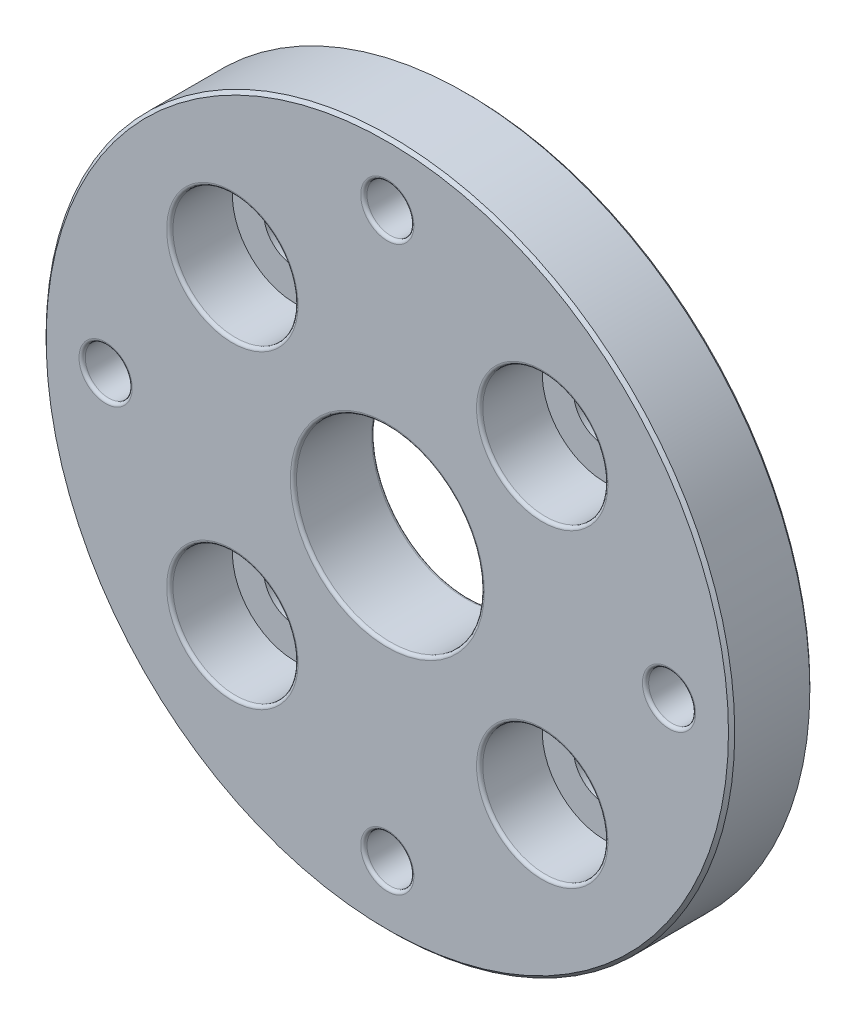
ISO-10303-21;
HEADER;
FILE_DESCRIPTION(('STEP AP214'),'2;1');
FILE_NAME('part.step','',(''),(''),'','','');
FILE_SCHEMA(('AUTOMOTIVE_DESIGN { 1 0 10303 214 1 1 1 1 }'));
ENDSEC;
DATA;
#1=APPLICATION_CONTEXT('core data for automotive mechanical design processes');
#2=APPLICATION_PROTOCOL_DEFINITION('international standard','automotive_design',2000,#1);
#3=PRODUCT_CONTEXT('',#1,'mechanical');
#4=PRODUCT('Part','Part','',(#3));
#5=PRODUCT_RELATED_PRODUCT_CATEGORY('part','',(#4));
#6=PRODUCT_DEFINITION_FORMATION('','',#4);
#7=PRODUCT_DEFINITION_CONTEXT('part definition',#1,'design');
#8=PRODUCT_DEFINITION('design','',#6,#7);
#9=PRODUCT_DEFINITION_SHAPE('','',#8);
#10=(LENGTH_UNIT() NAMED_UNIT(*) SI_UNIT(.MILLI.,.METRE.));
#11=(NAMED_UNIT(*) PLANE_ANGLE_UNIT() SI_UNIT($,.RADIAN.));
#12=(NAMED_UNIT(*) SI_UNIT($,.STERADIAN.) SOLID_ANGLE_UNIT());
#13=UNCERTAINTY_MEASURE_WITH_UNIT(LENGTH_MEASURE(1.E-05),#10,'distance_accuracy_value','');
#14=(GEOMETRIC_REPRESENTATION_CONTEXT(3) GLOBAL_UNCERTAINTY_ASSIGNED_CONTEXT((#13)) GLOBAL_UNIT_ASSIGNED_CONTEXT((#10,
#11,#12)) REPRESENTATION_CONTEXT('',''));
#15=CARTESIAN_POINT('',(0.,0.,0.));
#16=DIRECTION('',(0.,0.,1.));
#17=DIRECTION('',(1.,0.,0.));
#18=AXIS2_PLACEMENT_3D('',#15,#16,#17);
#19=CARTESIAN_POINT('',(4.94974746830582,4.94974746830584,0.));
#20=DIRECTION('',(0.,0.,1.));
#21=DIRECTION('',(1.,0.,0.));
#22=AXIS2_PLACEMENT_3D('',#19,#20,#21);
#23=CYLINDRICAL_SURFACE('',#22,1.);
#24=CARTESIAN_POINT('',(4.94974746830582,4.94974746830584,0.1));
#25=DIRECTION('',(0.,0.,1.));
#26=DIRECTION('',(1.,0.,0.));
#27=AXIS2_PLACEMENT_3D('',#24,#25,#26);
#28=CIRCLE('',#27,1.);
#29=CARTESIAN_POINT('',(5.94974746830582,4.94974746830584,0.1));
#30=VERTEX_POINT('',#29);
#31=EDGE_CURVE('E116',#30,#30,#28,.F.);
#32=ORIENTED_EDGE('',*,*,#31,.T.);
#33=EDGE_LOOP('',(#32));
#34=FACE_BOUND('',#33,.T.);
#35=CARTESIAN_POINT('',(4.94974746830582,4.94974746830584,0.6));
#36=DIRECTION('',(0.,0.,1.));
#37=DIRECTION('',(1.,0.,0.));
#38=AXIS2_PLACEMENT_3D('',#35,#36,#37);
#39=CIRCLE('',#38,1.);
#40=CARTESIAN_POINT('',(5.94974746830582,4.94974746830584,0.6));
#41=VERTEX_POINT('',#40);
#42=EDGE_CURVE('E158',#41,#41,#39,.F.);
#43=ORIENTED_EDGE('',*,*,#42,.F.);
#44=EDGE_LOOP('',(#43));
#45=FACE_BOUND('',#44,.T.);
#46=ADVANCED_FACE('F30',(#34,#45),#23,.F.);
#47=CARTESIAN_POINT('',(4.94974746830612,-4.94974746830582,0.));
#48=DIRECTION('',(0.,0.,1.));
#49=DIRECTION('',(1.,0.,0.));
#50=AXIS2_PLACEMENT_3D('',#47,#48,#49);
#51=CYLINDRICAL_SURFACE('',#50,0.99999999999993);
#52=CARTESIAN_POINT('',(4.94974746830612,-4.94974746830582,0.1));
#53=DIRECTION('',(0.,0.,1.));
#54=DIRECTION('',(1.,0.,0.));
#55=AXIS2_PLACEMENT_3D('',#52,#53,#54);
#56=CIRCLE('',#55,0.99999999999993);
#57=CARTESIAN_POINT('',(5.94974746830605,-4.94974746830582,0.1));
#58=VERTEX_POINT('',#57);
#59=EDGE_CURVE('E107',#58,#58,#56,.F.);
#60=ORIENTED_EDGE('',*,*,#59,.T.);
#61=EDGE_LOOP('',(#60));
#62=FACE_BOUND('',#61,.T.);
#63=CARTESIAN_POINT('',(4.94974746830612,-4.94974746830582,0.6));
#64=DIRECTION('',(0.,0.,1.));
#65=DIRECTION('',(1.,0.,0.));
#66=AXIS2_PLACEMENT_3D('',#63,#64,#65);
#67=CIRCLE('',#66,0.99999999999993);
#68=CARTESIAN_POINT('',(5.94974746830605,-4.94974746830582,0.6));
#69=VERTEX_POINT('',#68);
#70=EDGE_CURVE('E161',#69,#69,#67,.F.);
#71=ORIENTED_EDGE('',*,*,#70,.F.);
#72=EDGE_LOOP('',(#71));
#73=FACE_BOUND('',#72,.T.);
#74=ADVANCED_FACE('F202',(#62,#73),#51,.F.);
#75=CARTESIAN_POINT('',(-4.94974746830555,-4.94974746830612,0.));
#76=DIRECTION('',(0.,0.,1.));
#77=DIRECTION('',(1.,0.,0.));
#78=AXIS2_PLACEMENT_3D('',#75,#76,#77);
#79=CYLINDRICAL_SURFACE('',#78,1.00000000000021);
#80=CARTESIAN_POINT('',(-4.94974746830555,-4.94974746830612,0.1));
#81=DIRECTION('',(0.,0.,1.));
#82=DIRECTION('',(1.,0.,0.));
#83=AXIS2_PLACEMENT_3D('',#80,#81,#82);
#84=CIRCLE('',#83,1.00000000000021);
#85=CARTESIAN_POINT('',(-3.94974746830534,-4.94974746830612,0.1));
#86=VERTEX_POINT('',#85);
#87=EDGE_CURVE('E98',#86,#86,#84,.F.);
#88=ORIENTED_EDGE('',*,*,#87,.T.);
#89=EDGE_LOOP('',(#88));
#90=FACE_BOUND('',#89,.T.);
#91=CARTESIAN_POINT('',(-4.94974746830555,-4.94974746830612,0.6));
#92=DIRECTION('',(0.,0.,1.));
#93=DIRECTION('',(1.,0.,0.));
#94=AXIS2_PLACEMENT_3D('',#91,#92,#93);
#95=CIRCLE('',#94,1.00000000000021);
#96=CARTESIAN_POINT('',(-3.94974746830534,-4.94974746830612,0.6));
#97=VERTEX_POINT('',#96);
#98=EDGE_CURVE('E164',#97,#97,#95,.F.);
#99=ORIENTED_EDGE('',*,*,#98,.F.);
#100=EDGE_LOOP('',(#99));
#101=FACE_BOUND('',#100,.T.);
#102=ADVANCED_FACE('F208',(#90,#101),#79,.F.);
#103=CARTESIAN_POINT('',(-4.94974746830584,4.94974746830555,0.));
#104=DIRECTION('',(0.,0.,1.));
#105=DIRECTION('',(1.,0.,0.));
#106=AXIS2_PLACEMENT_3D('',#103,#104,#105);
#107=CYLINDRICAL_SURFACE('',#106,1.0000000000003);
#108=CARTESIAN_POINT('',(-4.94974746830584,4.94974746830555,0.1));
#109=DIRECTION('',(0.,0.,1.));
#110=DIRECTION('',(1.,0.,0.));
#111=AXIS2_PLACEMENT_3D('',#108,#109,#110);
#112=CIRCLE('',#111,1.0000000000003);
#113=CARTESIAN_POINT('',(-3.94974746830554,4.94974746830555,0.1));
#114=VERTEX_POINT('',#113);
#115=EDGE_CURVE('E89',#114,#114,#112,.F.);
#116=ORIENTED_EDGE('',*,*,#115,.T.);
#117=EDGE_LOOP('',(#116));
#118=FACE_BOUND('',#117,.T.);
#119=CARTESIAN_POINT('',(-4.94974746830584,4.94974746830555,0.6));
#120=DIRECTION('',(0.,0.,1.));
#121=DIRECTION('',(1.,0.,0.));
#122=AXIS2_PLACEMENT_3D('',#119,#120,#121);
#123=CIRCLE('',#122,1.0000000000003);
#124=CARTESIAN_POINT('',(-3.94974746830554,4.94974746830555,0.6));
#125=VERTEX_POINT('',#124);
#126=EDGE_CURVE('E167',#125,#125,#123,.F.);
#127=ORIENTED_EDGE('',*,*,#126,.F.);
#128=EDGE_LOOP('',(#127));
#129=FACE_BOUND('',#128,.T.);
#130=ADVANCED_FACE('F214',(#118,#129),#107,.F.);
#131=CARTESIAN_POINT('',(0.,0.,2.6));
#132=DIRECTION('',(0.,0.,-1.));
#133=DIRECTION('',(-1.,0.,0.));
#134=AXIS2_PLACEMENT_3D('',#131,#132,#133);
#135=CYLINDRICAL_SURFACE('',#134,11.);
#136=CARTESIAN_POINT('',(0.,0.,0.0999999999999994));
#137=DIRECTION('',(0.,0.,1.));
#138=DIRECTION('',(1.,0.,0.));
#139=AXIS2_PLACEMENT_3D('',#136,#137,#138);
#140=CIRCLE('',#139,11.);
#141=CARTESIAN_POINT('',(11.,0.,0.0999999999999994));
#142=VERTEX_POINT('',#141);
#143=EDGE_CURVE('E152',#142,#142,#140,.T.);
#144=ORIENTED_EDGE('',*,*,#143,.T.);
#145=EDGE_LOOP('',(#144));
#146=FACE_BOUND('',#145,.T.);
#147=CARTESIAN_POINT('',(0.,0.,2.5));
#148=DIRECTION('',(0.,0.,1.));
#149=DIRECTION('',(1.,0.,0.));
#150=AXIS2_PLACEMENT_3D('',#147,#148,#149);
#151=CIRCLE('',#150,11.);
#152=CARTESIAN_POINT('',(11.,0.,2.5));
#153=VERTEX_POINT('',#152);
#154=EDGE_CURVE('E155',#153,#153,#151,.F.);
#155=ORIENTED_EDGE('',*,*,#154,.T.);
#156=EDGE_LOOP('',(#155));
#157=FACE_BOUND('',#156,.T.);
#158=ADVANCED_FACE('F233',(#146,#157),#135,.T.);
#159=CARTESIAN_POINT('',(0.,0.,2.6));
#160=DIRECTION('',(0.,0.,1.));
#161=DIRECTION('',(1.,0.,0.));
#162=AXIS2_PLACEMENT_3D('',#159,#160,#161);
#163=PLANE('',#162);
#164=CARTESIAN_POINT('',(9.00000000000025,2.54693202754403E-13,2.6));
#165=DIRECTION('',(0.,0.,1.));
#166=DIRECTION('',(1.,0.,0.));
#167=AXIS2_PLACEMENT_3D('',#164,#165,#166);
#168=CIRCLE('',#167,0.85);
#169=CARTESIAN_POINT('',(9.85000000000025,2.54693202754403E-13,2.6));
#170=VERTEX_POINT('',#169);
#171=EDGE_CURVE('E56',#170,#170,#168,.F.);
#172=ORIENTED_EDGE('',*,*,#171,.T.);
#173=EDGE_LOOP('',(#172));
#174=FACE_BOUND('',#173,.T.);
#175=CARTESIAN_POINT('',(5.09386405508807E-13,-9.,2.6));
#176=DIRECTION('',(0.,0.,1.));
#177=DIRECTION('',(1.,0.,0.));
#178=AXIS2_PLACEMENT_3D('',#175,#176,#177);
#179=CIRCLE('',#178,0.85);
#180=CARTESIAN_POINT('',(0.85000000000051,-9.,2.6));
#181=VERTEX_POINT('',#180);
#182=EDGE_CURVE('E59',#181,#181,#179,.F.);
#183=ORIENTED_EDGE('',*,*,#182,.T.);
#184=EDGE_LOOP('',(#183));
#185=FACE_BOUND('',#184,.T.);
#186=CARTESIAN_POINT('',(-8.99999999999974,-2.55795384873636E-13,2.6));
#187=DIRECTION('',(0.,0.,1.));
#188=DIRECTION('',(1.,0.,0.));
#189=AXIS2_PLACEMENT_3D('',#186,#187,#188);
#190=CIRCLE('',#189,0.85);
#191=CARTESIAN_POINT('',(-8.14999999999974,-2.55795384873636E-13,2.6));
#192=VERTEX_POINT('',#191);
#193=EDGE_CURVE('E62',#192,#192,#190,.F.);
#194=ORIENTED_EDGE('',*,*,#193,.T.);
#195=EDGE_LOOP('',(#194));
#196=FACE_BOUND('',#195,.T.);
#197=CARTESIAN_POINT('',(0.,9.,2.6));
#198=DIRECTION('',(0.,0.,1.));
#199=DIRECTION('',(1.,0.,0.));
#200=AXIS2_PLACEMENT_3D('',#197,#198,#199);
#201=CIRCLE('',#200,0.85);
#202=CARTESIAN_POINT('',(0.85,9.,2.6));
#203=VERTEX_POINT('',#202);
#204=EDGE_CURVE('E65',#203,#203,#201,.F.);
#205=ORIENTED_EDGE('',*,*,#204,.T.);
#206=EDGE_LOOP('',(#205));
#207=FACE_BOUND('',#206,.T.);
#208=CARTESIAN_POINT('',(4.94974746830612,-4.94974746830582,2.6));
#209=DIRECTION('',(0.,0.,1.));
#210=DIRECTION('',(1.,0.,0.));
#211=AXIS2_PLACEMENT_3D('',#208,#209,#210);
#212=CIRCLE('',#211,2.09999999999993);
#213=CARTESIAN_POINT('',(7.04974746830605,-4.94974746830582,2.6));
#214=VERTEX_POINT('',#213);
#215=EDGE_CURVE('E68',#214,#214,#212,.F.);
#216=ORIENTED_EDGE('',*,*,#215,.T.);
#217=EDGE_LOOP('',(#216));
#218=FACE_BOUND('',#217,.T.);
#219=CARTESIAN_POINT('',(-4.94974746830555,-4.94974746830612,2.6));
#220=DIRECTION('',(0.,0.,1.));
#221=DIRECTION('',(1.,0.,0.));
#222=AXIS2_PLACEMENT_3D('',#219,#220,#221);
#223=CIRCLE('',#222,2.10000000000021);
#224=CARTESIAN_POINT('',(-2.84974746830534,-4.94974746830612,2.6));
#225=VERTEX_POINT('',#224);
#226=EDGE_CURVE('E71',#225,#225,#223,.F.);
#227=ORIENTED_EDGE('',*,*,#226,.T.);
#228=EDGE_LOOP('',(#227));
#229=FACE_BOUND('',#228,.T.);
#230=CARTESIAN_POINT('',(-4.94974746830584,4.94974746830555,2.6));
#231=DIRECTION('',(0.,0.,1.));
#232=DIRECTION('',(1.,0.,0.));
#233=AXIS2_PLACEMENT_3D('',#230,#231,#232);
#234=CIRCLE('',#233,2.1000000000003);
#235=CARTESIAN_POINT('',(-2.84974746830554,4.94974746830555,2.6));
#236=VERTEX_POINT('',#235);
#237=EDGE_CURVE('E74',#236,#236,#234,.F.);
#238=ORIENTED_EDGE('',*,*,#237,.T.);
#239=EDGE_LOOP('',(#238));
#240=FACE_BOUND('',#239,.T.);
#241=CARTESIAN_POINT('',(0.,0.,2.6));
#242=DIRECTION('',(0.,0.,1.));
#243=DIRECTION('',(1.,0.,0.));
#244=AXIS2_PLACEMENT_3D('',#241,#242,#243);
#245=CIRCLE('',#244,3.1);
#246=CARTESIAN_POINT('',(3.1,0.,2.6));
#247=VERTEX_POINT('',#246);
#248=EDGE_CURVE('E77',#247,#247,#245,.F.);
#249=ORIENTED_EDGE('',*,*,#248,.T.);
#250=EDGE_LOOP('',(#249));
#251=FACE_BOUND('',#250,.T.);
#252=CARTESIAN_POINT('',(4.94974746830582,4.94974746830584,2.6));
#253=DIRECTION('',(0.,0.,1.));
#254=DIRECTION('',(1.,0.,0.));
#255=AXIS2_PLACEMENT_3D('',#252,#253,#254);
#256=CIRCLE('',#255,2.1);
#257=CARTESIAN_POINT('',(7.04974746830583,4.94974746830584,2.6));
#258=VERTEX_POINT('',#257);
#259=EDGE_CURVE('E80',#258,#258,#256,.F.);
#260=ORIENTED_EDGE('',*,*,#259,.T.);
#261=EDGE_LOOP('',(#260));
#262=FACE_BOUND('',#261,.T.);
#263=CARTESIAN_POINT('',(0.,0.,2.6));
#264=DIRECTION('',(0.,0.,1.));
#265=DIRECTION('',(1.,0.,0.));
#266=AXIS2_PLACEMENT_3D('',#263,#264,#265);
#267=CIRCLE('',#266,10.9);
#268=CARTESIAN_POINT('',(10.9,0.,2.6));
#269=VERTEX_POINT('',#268);
#270=EDGE_CURVE('E146',#269,#269,#267,.T.);
#271=ORIENTED_EDGE('',*,*,#270,.T.);
#272=EDGE_LOOP('',(#271));
#273=FACE_BOUND('',#272,.T.);
#274=ADVANCED_FACE('F230',(#174,#185,#196,#207,#218,#229,#240,#251,#262,#273),#163,.T.);
#275=CARTESIAN_POINT('',(0.,0.,0.));
#276=DIRECTION('',(0.,0.,1.));
#277=DIRECTION('',(1.,0.,0.));
#278=AXIS2_PLACEMENT_3D('',#275,#276,#277);
#279=PLANE('',#278);
#280=CARTESIAN_POINT('',(4.94974746830582,4.94974746830584,0.));
#281=DIRECTION('',(0.,0.,1.));
#282=DIRECTION('',(1.,0.,0.));
#283=AXIS2_PLACEMENT_3D('',#280,#281,#282);
#284=CIRCLE('',#283,1.1);
#285=CARTESIAN_POINT('',(6.04974746830582,4.94974746830584,0.));
#286=VERTEX_POINT('',#285);
#287=EDGE_CURVE('E119',#286,#286,#284,.T.);
#288=ORIENTED_EDGE('',*,*,#287,.T.);
#289=EDGE_LOOP('',(#288));
#290=FACE_BOUND('',#289,.T.);
#291=CARTESIAN_POINT('',(9.00000000000025,2.54693202754403E-13,0.));
#292=DIRECTION('',(0.,0.,1.));
#293=DIRECTION('',(1.,0.,0.));
#294=AXIS2_PLACEMENT_3D('',#291,#292,#293);
#295=CIRCLE('',#294,0.85);
#296=CARTESIAN_POINT('',(9.85000000000025,2.54693202754403E-13,0.));
#297=VERTEX_POINT('',#296);
#298=EDGE_CURVE('E122',#297,#297,#295,.T.);
#299=ORIENTED_EDGE('',*,*,#298,.T.);
#300=EDGE_LOOP('',(#299));
#301=FACE_BOUND('',#300,.T.);
#302=CARTESIAN_POINT('',(4.94974746830612,-4.94974746830582,0.));
#303=DIRECTION('',(0.,0.,1.));
#304=DIRECTION('',(1.,0.,0.));
#305=AXIS2_PLACEMENT_3D('',#302,#303,#304);
#306=CIRCLE('',#305,1.09999999999993);
#307=CARTESIAN_POINT('',(6.04974746830605,-4.94974746830582,0.));
#308=VERTEX_POINT('',#307);
#309=EDGE_CURVE('E125',#308,#308,#306,.T.);
#310=ORIENTED_EDGE('',*,*,#309,.T.);
#311=EDGE_LOOP('',(#310));
#312=FACE_BOUND('',#311,.T.);
#313=CARTESIAN_POINT('',(5.09386405508807E-13,-9.,0.));
#314=DIRECTION('',(0.,0.,1.));
#315=DIRECTION('',(1.,0.,0.));
#316=AXIS2_PLACEMENT_3D('',#313,#314,#315);
#317=CIRCLE('',#316,0.85);
#318=CARTESIAN_POINT('',(0.85000000000051,-9.,0.));
#319=VERTEX_POINT('',#318);
#320=EDGE_CURVE('E128',#319,#319,#317,.T.);
#321=ORIENTED_EDGE('',*,*,#320,.T.);
#322=EDGE_LOOP('',(#321));
#323=FACE_BOUND('',#322,.T.);
#324=CARTESIAN_POINT('',(-4.94974746830555,-4.94974746830612,0.));
#325=DIRECTION('',(0.,0.,1.));
#326=DIRECTION('',(1.,0.,0.));
#327=AXIS2_PLACEMENT_3D('',#324,#325,#326);
#328=CIRCLE('',#327,1.10000000000021);
#329=CARTESIAN_POINT('',(-3.84974746830534,-4.94974746830612,0.));
#330=VERTEX_POINT('',#329);
#331=EDGE_CURVE('E131',#330,#330,#328,.T.);
#332=ORIENTED_EDGE('',*,*,#331,.T.);
#333=EDGE_LOOP('',(#332));
#334=FACE_BOUND('',#333,.T.);
#335=CARTESIAN_POINT('',(0.,9.,0.));
#336=DIRECTION('',(0.,0.,1.));
#337=DIRECTION('',(1.,0.,0.));
#338=AXIS2_PLACEMENT_3D('',#335,#336,#337);
#339=CIRCLE('',#338,0.85);
#340=CARTESIAN_POINT('',(0.85,9.,0.));
#341=VERTEX_POINT('',#340);
#342=EDGE_CURVE('E134',#341,#341,#339,.T.);
#343=ORIENTED_EDGE('',*,*,#342,.T.);
#344=EDGE_LOOP('',(#343));
#345=FACE_BOUND('',#344,.T.);
#346=CARTESIAN_POINT('',(-4.94974746830584,4.94974746830555,0.));
#347=DIRECTION('',(0.,0.,1.));
#348=DIRECTION('',(1.,0.,0.));
#349=AXIS2_PLACEMENT_3D('',#346,#347,#348);
#350=CIRCLE('',#349,1.1000000000003);
#351=CARTESIAN_POINT('',(-3.84974746830554,4.94974746830555,0.));
#352=VERTEX_POINT('',#351);
#353=EDGE_CURVE('E137',#352,#352,#350,.T.);
#354=ORIENTED_EDGE('',*,*,#353,.T.);
#355=EDGE_LOOP('',(#354));
#356=FACE_BOUND('',#355,.T.);
#357=CARTESIAN_POINT('',(-8.99999999999974,-2.55795384873636E-13,0.));
#358=DIRECTION('',(0.,0.,1.));
#359=DIRECTION('',(1.,0.,0.));
#360=AXIS2_PLACEMENT_3D('',#357,#358,#359);
#361=CIRCLE('',#360,0.85);
#362=CARTESIAN_POINT('',(-8.14999999999974,-2.55795384873636E-13,0.));
#363=VERTEX_POINT('',#362);
#364=EDGE_CURVE('E140',#363,#363,#361,.T.);
#365=ORIENTED_EDGE('',*,*,#364,.T.);
#366=EDGE_LOOP('',(#365));
#367=FACE_BOUND('',#366,.T.);
#368=CARTESIAN_POINT('',(0.,0.,0.));
#369=DIRECTION('',(0.,0.,1.));
#370=DIRECTION('',(1.,0.,0.));
#371=AXIS2_PLACEMENT_3D('',#368,#369,#370);
#372=CIRCLE('',#371,3.1);
#373=CARTESIAN_POINT('',(3.1,0.,0.));
#374=VERTEX_POINT('',#373);
#375=EDGE_CURVE('E143',#374,#374,#372,.T.);
#376=ORIENTED_EDGE('',*,*,#375,.T.);
#377=EDGE_LOOP('',(#376));
#378=FACE_BOUND('',#377,.T.);
#379=CARTESIAN_POINT('',(0.,0.,0.));
#380=DIRECTION('',(0.,0.,1.));
#381=DIRECTION('',(1.,0.,0.));
#382=AXIS2_PLACEMENT_3D('',#379,#380,#381);
#383=CIRCLE('',#382,10.9);
#384=CARTESIAN_POINT('',(10.9,0.,0.));
#385=VERTEX_POINT('',#384);
#386=EDGE_CURVE('E149',#385,#385,#383,.F.);
#387=ORIENTED_EDGE('',*,*,#386,.T.);
#388=EDGE_LOOP('',(#387));
#389=FACE_BOUND('',#388,.T.);
#390=ADVANCED_FACE('F220',(#290,#301,#312,#323,#334,#345,#356,#367,#378,#389),#279,.F.);
#391=CARTESIAN_POINT('',(9.00000000000025,2.54693202754403E-13,0.));
#392=DIRECTION('',(0.,0.,1.));
#393=DIRECTION('',(1.,0.,0.));
#394=AXIS2_PLACEMENT_3D('',#391,#392,#393);
#395=CYLINDRICAL_SURFACE('',#394,0.75);
#396=CARTESIAN_POINT('',(9.00000000000025,2.54693202754403E-13,0.1));
#397=DIRECTION('',(0.,0.,1.));
#398=DIRECTION('',(1.,0.,0.));
#399=AXIS2_PLACEMENT_3D('',#396,#397,#398);
#400=CIRCLE('',#399,0.75);
#401=CARTESIAN_POINT('',(9.75000000000025,2.54693202754403E-13,0.1));
#402=VERTEX_POINT('',#401);
#403=EDGE_CURVE('E110',#402,#402,#400,.F.);
#404=ORIENTED_EDGE('',*,*,#403,.T.);
#405=EDGE_LOOP('',(#404));
#406=FACE_BOUND('',#405,.T.);
#407=CARTESIAN_POINT('',(9.00000000000025,2.54693202754403E-13,2.5));
#408=DIRECTION('',(0.,0.,1.));
#409=DIRECTION('',(1.,0.,0.));
#410=AXIS2_PLACEMENT_3D('',#407,#408,#409);
#411=CIRCLE('',#410,0.75);
#412=CARTESIAN_POINT('',(9.75000000000025,2.54693202754403E-13,2.5));
#413=VERTEX_POINT('',#412);
#414=EDGE_CURVE('E113',#413,#413,#411,.T.);
#415=ORIENTED_EDGE('',*,*,#414,.T.);
#416=EDGE_LOOP('',(#415));
#417=FACE_BOUND('',#416,.T.);
#418=ADVANCED_FACE('F216',(#406,#417),#395,.F.);
#419=CARTESIAN_POINT('',(5.09386405508807E-13,-9.,0.));
#420=DIRECTION('',(0.,0.,1.));
#421=DIRECTION('',(1.,0.,0.));
#422=AXIS2_PLACEMENT_3D('',#419,#420,#421);
#423=CYLINDRICAL_SURFACE('',#422,0.75);
#424=CARTESIAN_POINT('',(5.09386405508807E-13,-9.,0.1));
#425=DIRECTION('',(0.,0.,1.));
#426=DIRECTION('',(1.,0.,0.));
#427=AXIS2_PLACEMENT_3D('',#424,#425,#426);
#428=CIRCLE('',#427,0.75);
#429=CARTESIAN_POINT('',(0.75000000000051,-9.,0.1));
#430=VERTEX_POINT('',#429);
#431=EDGE_CURVE('E101',#430,#430,#428,.F.);
#432=ORIENTED_EDGE('',*,*,#431,.T.);
#433=EDGE_LOOP('',(#432));
#434=FACE_BOUND('',#433,.T.);
#435=CARTESIAN_POINT('',(5.09386405508807E-13,-9.,2.5));
#436=DIRECTION('',(0.,0.,1.));
#437=DIRECTION('',(1.,0.,0.));
#438=AXIS2_PLACEMENT_3D('',#435,#436,#437);
#439=CIRCLE('',#438,0.75);
#440=CARTESIAN_POINT('',(0.75000000000051,-9.,2.5));
#441=VERTEX_POINT('',#440);
#442=EDGE_CURVE('E104',#441,#441,#439,.T.);
#443=ORIENTED_EDGE('',*,*,#442,.T.);
#444=EDGE_LOOP('',(#443));
#445=FACE_BOUND('',#444,.T.);
#446=ADVANCED_FACE('F219',(#434,#445),#423,.F.);
#447=CARTESIAN_POINT('',(-8.99999999999974,-2.55795384873636E-13,0.));
#448=DIRECTION('',(0.,0.,1.));
#449=DIRECTION('',(1.,0.,0.));
#450=AXIS2_PLACEMENT_3D('',#447,#448,#449);
#451=CYLINDRICAL_SURFACE('',#450,0.75);
#452=CARTESIAN_POINT('',(-8.99999999999974,-2.55795384873636E-13,0.1));
#453=DIRECTION('',(0.,0.,1.));
#454=DIRECTION('',(1.,0.,0.));
#455=AXIS2_PLACEMENT_3D('',#452,#453,#454);
#456=CIRCLE('',#455,0.75);
#457=CARTESIAN_POINT('',(-8.24999999999974,-2.55795384873636E-13,0.1));
#458=VERTEX_POINT('',#457);
#459=EDGE_CURVE('E83',#458,#458,#456,.F.);
#460=ORIENTED_EDGE('',*,*,#459,.T.);
#461=EDGE_LOOP('',(#460));
#462=FACE_BOUND('',#461,.T.);
#463=CARTESIAN_POINT('',(-8.99999999999974,-2.55795384873636E-13,2.5));
#464=DIRECTION('',(0.,0.,1.));
#465=DIRECTION('',(1.,0.,0.));
#466=AXIS2_PLACEMENT_3D('',#463,#464,#465);
#467=CIRCLE('',#466,0.75);
#468=CARTESIAN_POINT('',(-8.24999999999974,-2.55795384873636E-13,2.5));
#469=VERTEX_POINT('',#468);
#470=EDGE_CURVE('E86',#469,#469,#467,.T.);
#471=ORIENTED_EDGE('',*,*,#470,.T.);
#472=EDGE_LOOP('',(#471));
#473=FACE_BOUND('',#472,.T.);
#474=ADVANCED_FACE('F224',(#462,#473),#451,.F.);
#475=CARTESIAN_POINT('',(0.,9.,0.));
#476=DIRECTION('',(0.,0.,1.));
#477=DIRECTION('',(1.,0.,0.));
#478=AXIS2_PLACEMENT_3D('',#475,#476,#477);
#479=CYLINDRICAL_SURFACE('',#478,0.75);
#480=CARTESIAN_POINT('',(0.,9.,0.1));
#481=DIRECTION('',(0.,0.,1.));
#482=DIRECTION('',(1.,0.,0.));
#483=AXIS2_PLACEMENT_3D('',#480,#481,#482);
#484=CIRCLE('',#483,0.75);
#485=CARTESIAN_POINT('',(0.75,9.,0.1));
#486=VERTEX_POINT('',#485);
#487=EDGE_CURVE('E92',#486,#486,#484,.F.);
#488=ORIENTED_EDGE('',*,*,#487,.T.);
#489=EDGE_LOOP('',(#488));
#490=FACE_BOUND('',#489,.T.);
#491=CARTESIAN_POINT('',(0.,9.,2.5));
#492=DIRECTION('',(0.,0.,1.));
#493=DIRECTION('',(1.,0.,0.));
#494=AXIS2_PLACEMENT_3D('',#491,#492,#493);
#495=CIRCLE('',#494,0.75);
#496=CARTESIAN_POINT('',(0.75,9.,2.5));
#497=VERTEX_POINT('',#496);
#498=EDGE_CURVE('E95',#497,#497,#495,.T.);
#499=ORIENTED_EDGE('',*,*,#498,.T.);
#500=EDGE_LOOP('',(#499));
#501=FACE_BOUND('',#500,.T.);
#502=ADVANCED_FACE('F228',(#490,#501),#479,.F.);
#503=CARTESIAN_POINT('',(-4.94974746830584,4.94974746830555,0.6));
#504=DIRECTION('',(0.,0.,1.));
#505=DIRECTION('',(1.,0.,0.));
#506=AXIS2_PLACEMENT_3D('',#503,#504,#505);
#507=PLANE('',#506);
#508=CARTESIAN_POINT('',(-4.94974746830584,4.94974746830555,0.6));
#509=DIRECTION('',(0.,0.,1.));
#510=DIRECTION('',(1.,0.,0.));
#511=AXIS2_PLACEMENT_3D('',#508,#509,#510);
#512=CIRCLE('',#511,2.0000000000003);
#513=CARTESIAN_POINT('',(-2.94974746830554,4.94974746830555,0.6));
#514=VERTEX_POINT('',#513);
#515=EDGE_CURVE('E174',#514,#514,#512,.T.);
#516=ORIENTED_EDGE('',*,*,#515,.T.);
#517=EDGE_LOOP('',(#516));
#518=FACE_BOUND('',#517,.T.);
#519=ORIENTED_EDGE('',*,*,#126,.T.);
#520=EDGE_LOOP('',(#519));
#521=FACE_BOUND('',#520,.T.);
#522=ADVANCED_FACE('F346',(#518,#521),#507,.T.);
#523=CARTESIAN_POINT('',(-4.94974746830584,4.94974746830555,0.6));
#524=DIRECTION('',(0.,0.,1.));
#525=DIRECTION('',(1.,0.,0.));
#526=AXIS2_PLACEMENT_3D('',#523,#524,#525);
#527=CYLINDRICAL_SURFACE('',#526,2.0000000000003);
#528=CARTESIAN_POINT('',(-4.94974746830584,4.94974746830555,2.5));
#529=DIRECTION('',(0.,0.,1.));
#530=DIRECTION('',(1.,0.,0.));
#531=AXIS2_PLACEMENT_3D('',#528,#529,#530);
#532=CIRCLE('',#531,2.0000000000003);
#533=CARTESIAN_POINT('',(-2.94974746830554,4.94974746830555,2.5));
#534=VERTEX_POINT('',#533);
#535=EDGE_CURVE('E45',#534,#534,#532,.T.);
#536=ORIENTED_EDGE('',*,*,#535,.T.);
#537=EDGE_LOOP('',(#536));
#538=FACE_BOUND('',#537,.T.);
#539=ORIENTED_EDGE('',*,*,#515,.F.);
#540=EDGE_LOOP('',(#539));
#541=FACE_BOUND('',#540,.T.);
#542=ADVANCED_FACE('F360',(#538,#541),#527,.F.);
#543=CARTESIAN_POINT('',(-4.94974746830555,-4.94974746830612,0.6));
#544=DIRECTION('',(0.,0.,1.));
#545=DIRECTION('',(1.,0.,0.));
#546=AXIS2_PLACEMENT_3D('',#543,#544,#545);
#547=PLANE('',#546);
#548=CARTESIAN_POINT('',(-4.94974746830555,-4.94974746830612,0.6));
#549=DIRECTION('',(0.,0.,1.));
#550=DIRECTION('',(1.,0.,0.));
#551=AXIS2_PLACEMENT_3D('',#548,#549,#550);
#552=CIRCLE('',#551,2.00000000000021);
#553=CARTESIAN_POINT('',(-2.94974746830534,-4.94974746830612,0.6));
#554=VERTEX_POINT('',#553);
#555=EDGE_CURVE('E177',#554,#554,#552,.T.);
#556=ORIENTED_EDGE('',*,*,#555,.T.);
#557=EDGE_LOOP('',(#556));
#558=FACE_BOUND('',#557,.T.);
#559=ORIENTED_EDGE('',*,*,#98,.T.);
#560=EDGE_LOOP('',(#559));
#561=FACE_BOUND('',#560,.T.);
#562=ADVANCED_FACE('F358',(#558,#561),#547,.T.);
#563=CARTESIAN_POINT('',(-4.94974746830555,-4.94974746830612,0.6));
#564=DIRECTION('',(0.,0.,1.));
#565=DIRECTION('',(1.,0.,0.));
#566=AXIS2_PLACEMENT_3D('',#563,#564,#565);
#567=CYLINDRICAL_SURFACE('',#566,2.00000000000021);
#568=CARTESIAN_POINT('',(-4.94974746830555,-4.94974746830612,2.5));
#569=DIRECTION('',(0.,0.,1.));
#570=DIRECTION('',(1.,0.,0.));
#571=AXIS2_PLACEMENT_3D('',#568,#569,#570);
#572=CIRCLE('',#571,2.00000000000021);
#573=CARTESIAN_POINT('',(-2.94974746830534,-4.94974746830612,2.5));
#574=VERTEX_POINT('',#573);
#575=EDGE_CURVE('E50',#574,#574,#572,.T.);
#576=ORIENTED_EDGE('',*,*,#575,.T.);
#577=EDGE_LOOP('',(#576));
#578=FACE_BOUND('',#577,.T.);
#579=ORIENTED_EDGE('',*,*,#555,.F.);
#580=EDGE_LOOP('',(#579));
#581=FACE_BOUND('',#580,.T.);
#582=ADVANCED_FACE('F198',(#578,#581),#567,.F.);
#583=CARTESIAN_POINT('',(4.94974746830612,-4.94974746830582,0.6));
#584=DIRECTION('',(0.,0.,1.));
#585=DIRECTION('',(1.,0.,0.));
#586=AXIS2_PLACEMENT_3D('',#583,#584,#585);
#587=PLANE('',#586);
#588=CARTESIAN_POINT('',(4.94974746830612,-4.94974746830582,0.6));
#589=DIRECTION('',(0.,0.,1.));
#590=DIRECTION('',(1.,0.,0.));
#591=AXIS2_PLACEMENT_3D('',#588,#589,#590);
#592=CIRCLE('',#591,1.99999999999993);
#593=CARTESIAN_POINT('',(6.94974746830605,-4.94974746830582,0.6));
#594=VERTEX_POINT('',#593);
#595=EDGE_CURVE('E173',#594,#594,#592,.T.);
#596=ORIENTED_EDGE('',*,*,#595,.T.);
#597=EDGE_LOOP('',(#596));
#598=FACE_BOUND('',#597,.T.);
#599=ORIENTED_EDGE('',*,*,#70,.T.);
#600=EDGE_LOOP('',(#599));
#601=FACE_BOUND('',#600,.T.);
#602=ADVANCED_FACE('F183',(#598,#601),#587,.T.);
#603=CARTESIAN_POINT('',(4.94974746830612,-4.94974746830582,0.6));
#604=DIRECTION('',(0.,0.,1.));
#605=DIRECTION('',(1.,0.,0.));
#606=AXIS2_PLACEMENT_3D('',#603,#604,#605);
#607=CYLINDRICAL_SURFACE('',#606,1.99999999999993);
#608=CARTESIAN_POINT('',(4.94974746830612,-4.94974746830582,2.5));
#609=DIRECTION('',(0.,0.,1.));
#610=DIRECTION('',(1.,0.,0.));
#611=AXIS2_PLACEMENT_3D('',#608,#609,#610);
#612=CIRCLE('',#611,1.99999999999993);
#613=CARTESIAN_POINT('',(6.94974746830605,-4.94974746830582,2.5));
#614=VERTEX_POINT('',#613);
#615=EDGE_CURVE('E53',#614,#614,#612,.T.);
#616=ORIENTED_EDGE('',*,*,#615,.T.);
#617=EDGE_LOOP('',(#616));
#618=FACE_BOUND('',#617,.T.);
#619=ORIENTED_EDGE('',*,*,#595,.F.);
#620=EDGE_LOOP('',(#619));
#621=FACE_BOUND('',#620,.T.);
#622=ADVANCED_FACE('F186',(#618,#621),#607,.F.);
#623=CARTESIAN_POINT('',(4.94974746830582,4.94974746830584,0.6));
#624=DIRECTION('',(0.,0.,1.));
#625=DIRECTION('',(1.,0.,0.));
#626=AXIS2_PLACEMENT_3D('',#623,#624,#625);
#627=PLANE('',#626);
#628=CARTESIAN_POINT('',(4.94974746830582,4.94974746830584,0.6));
#629=DIRECTION('',(0.,0.,1.));
#630=DIRECTION('',(1.,0.,0.));
#631=AXIS2_PLACEMENT_3D('',#628,#629,#630);
#632=CIRCLE('',#631,2.);
#633=CARTESIAN_POINT('',(6.94974746830583,4.94974746830584,0.6));
#634=VERTEX_POINT('',#633);
#635=EDGE_CURVE('E170',#634,#634,#632,.T.);
#636=ORIENTED_EDGE('',*,*,#635,.T.);
#637=EDGE_LOOP('',(#636));
#638=FACE_BOUND('',#637,.T.);
#639=ORIENTED_EDGE('',*,*,#42,.T.);
#640=EDGE_LOOP('',(#639));
#641=FACE_BOUND('',#640,.T.);
#642=ADVANCED_FACE('F188',(#638,#641),#627,.T.);
#643=CARTESIAN_POINT('',(4.94974746830582,4.94974746830584,0.6));
#644=DIRECTION('',(0.,0.,1.));
#645=DIRECTION('',(1.,0.,0.));
#646=AXIS2_PLACEMENT_3D('',#643,#644,#645);
#647=CYLINDRICAL_SURFACE('',#646,2.);
#648=CARTESIAN_POINT('',(4.94974746830582,4.94974746830584,2.5));
#649=DIRECTION('',(0.,0.,1.));
#650=DIRECTION('',(1.,0.,0.));
#651=AXIS2_PLACEMENT_3D('',#648,#649,#650);
#652=CIRCLE('',#651,2.);
#653=CARTESIAN_POINT('',(6.94974746830583,4.94974746830584,2.5));
#654=VERTEX_POINT('',#653);
#655=EDGE_CURVE('E10',#654,#654,#652,.T.);
#656=ORIENTED_EDGE('',*,*,#655,.T.);
#657=EDGE_LOOP('',(#656));
#658=FACE_BOUND('',#657,.T.);
#659=ORIENTED_EDGE('',*,*,#635,.F.);
#660=EDGE_LOOP('',(#659));
#661=FACE_BOUND('',#660,.T.);
#662=ADVANCED_FACE('F195',(#658,#661),#647,.F.);
#663=CARTESIAN_POINT('',(0.,0.,0.));
#664=DIRECTION('',(0.,0.,1.));
#665=DIRECTION('',(1.,0.,0.));
#666=AXIS2_PLACEMENT_3D('',#663,#664,#665);
#667=CYLINDRICAL_SURFACE('',#666,3.);
#668=CARTESIAN_POINT('',(0.,0.,2.5));
#669=DIRECTION('',(0.,0.,1.));
#670=DIRECTION('',(1.,0.,0.));
#671=AXIS2_PLACEMENT_3D('',#668,#669,#670);
#672=CIRCLE('',#671,3.);
#673=CARTESIAN_POINT('',(3.,0.,2.5));
#674=VERTEX_POINT('',#673);
#675=EDGE_CURVE('E37',#674,#674,#672,.T.);
#676=ORIENTED_EDGE('',*,*,#675,.T.);
#677=EDGE_LOOP('',(#676));
#678=FACE_BOUND('',#677,.T.);
#679=CARTESIAN_POINT('',(0.,0.,0.1));
#680=DIRECTION('',(0.,0.,1.));
#681=DIRECTION('',(1.,0.,0.));
#682=AXIS2_PLACEMENT_3D('',#679,#680,#681);
#683=CIRCLE('',#682,3.);
#684=CARTESIAN_POINT('',(3.,0.,0.1));
#685=VERTEX_POINT('',#684);
#686=EDGE_CURVE('E41',#685,#685,#683,.F.);
#687=ORIENTED_EDGE('',*,*,#686,.T.);
#688=EDGE_LOOP('',(#687));
#689=FACE_BOUND('',#688,.T.);
#690=ADVANCED_FACE('F245',(#678,#689),#667,.F.);
#691=CARTESIAN_POINT('',(0.,0.,0.0999999999999994));
#692=DIRECTION('',(0.,0.,1.));
#693=DIRECTION('',(1.,0.,0.));
#694=AXIS2_PLACEMENT_3D('',#691,#692,#693);
#695=CONICAL_SURFACE('',#694,11.,0.785398163397448);
#696=ORIENTED_EDGE('',*,*,#386,.F.);
#697=EDGE_LOOP('',(#696));
#698=FACE_BOUND('',#697,.T.);
#699=ORIENTED_EDGE('',*,*,#143,.F.);
#700=EDGE_LOOP('',(#699));
#701=FACE_BOUND('',#700,.T.);
#702=ADVANCED_FACE('F241',(#698,#701),#695,.T.);
#703=CARTESIAN_POINT('',(0.,0.,2.6));
#704=DIRECTION('',(0.,0.,-1.));
#705=DIRECTION('',(-1.,0.,0.));
#706=AXIS2_PLACEMENT_3D('',#703,#704,#705);
#707=CONICAL_SURFACE('',#706,10.9,0.785398163397483);
#708=ORIENTED_EDGE('',*,*,#154,.F.);
#709=EDGE_LOOP('',(#708));
#710=FACE_BOUND('',#709,.T.);
#711=ORIENTED_EDGE('',*,*,#270,.F.);
#712=EDGE_LOOP('',(#711));
#713=FACE_BOUND('',#712,.T.);
#714=ADVANCED_FACE('F244',(#710,#713),#707,.T.);
#715=CARTESIAN_POINT('',(4.94974746830582,4.94974746830584,0.1));
#716=DIRECTION('',(0.,0.,1.));
#717=DIRECTION('',(1.,0.,0.));
#718=AXIS2_PLACEMENT_3D('',#715,#716,#717);
#719=TOROIDAL_SURFACE('',#718,1.1,0.1);
#720=ORIENTED_EDGE('',*,*,#31,.F.);
#721=EDGE_LOOP('',(#720));
#722=FACE_BOUND('',#721,.T.);
#723=ORIENTED_EDGE('',*,*,#287,.F.);
#724=EDGE_LOOP('',(#723));
#725=FACE_BOUND('',#724,.T.);
#726=ADVANCED_FACE('F249',(#722,#725),#719,.T.);
#727=CARTESIAN_POINT('',(9.00000000000025,2.54693202754403E-13,0.1));
#728=DIRECTION('',(0.,0.,1.));
#729=DIRECTION('',(1.,0.,0.));
#730=AXIS2_PLACEMENT_3D('',#727,#728,#729);
#731=TOROIDAL_SURFACE('',#730,0.85,0.1);
#732=ORIENTED_EDGE('',*,*,#403,.F.);
#733=EDGE_LOOP('',(#732));
#734=FACE_BOUND('',#733,.T.);
#735=ORIENTED_EDGE('',*,*,#298,.F.);
#736=EDGE_LOOP('',(#735));
#737=FACE_BOUND('',#736,.T.);
#738=ADVANCED_FACE('F253',(#734,#737),#731,.T.);
#739=CARTESIAN_POINT('',(4.94974746830612,-4.94974746830582,0.1));
#740=DIRECTION('',(0.,0.,1.));
#741=DIRECTION('',(1.,0.,0.));
#742=AXIS2_PLACEMENT_3D('',#739,#740,#741);
#743=TOROIDAL_SURFACE('',#742,1.09999999999993,0.1);
#744=ORIENTED_EDGE('',*,*,#59,.F.);
#745=EDGE_LOOP('',(#744));
#746=FACE_BOUND('',#745,.T.);
#747=ORIENTED_EDGE('',*,*,#309,.F.);
#748=EDGE_LOOP('',(#747));
#749=FACE_BOUND('',#748,.T.);
#750=ADVANCED_FACE('F257',(#746,#749),#743,.T.);
#751=CARTESIAN_POINT('',(5.09386405508807E-13,-9.,0.1));
#752=DIRECTION('',(0.,0.,1.));
#753=DIRECTION('',(1.,0.,0.));
#754=AXIS2_PLACEMENT_3D('',#751,#752,#753);
#755=TOROIDAL_SURFACE('',#754,0.85,0.1);
#756=ORIENTED_EDGE('',*,*,#431,.F.);
#757=EDGE_LOOP('',(#756));
#758=FACE_BOUND('',#757,.T.);
#759=ORIENTED_EDGE('',*,*,#320,.F.);
#760=EDGE_LOOP('',(#759));
#761=FACE_BOUND('',#760,.T.);
#762=ADVANCED_FACE('F261',(#758,#761),#755,.T.);
#763=CARTESIAN_POINT('',(-4.94974746830555,-4.94974746830612,0.1));
#764=DIRECTION('',(0.,0.,1.));
#765=DIRECTION('',(1.,0.,0.));
#766=AXIS2_PLACEMENT_3D('',#763,#764,#765);
#767=TOROIDAL_SURFACE('',#766,1.10000000000021,0.1);
#768=ORIENTED_EDGE('',*,*,#87,.F.);
#769=EDGE_LOOP('',(#768));
#770=FACE_BOUND('',#769,.T.);
#771=ORIENTED_EDGE('',*,*,#331,.F.);
#772=EDGE_LOOP('',(#771));
#773=FACE_BOUND('',#772,.T.);
#774=ADVANCED_FACE('F265',(#770,#773),#767,.T.);
#775=CARTESIAN_POINT('',(0.,9.,0.1));
#776=DIRECTION('',(0.,0.,1.));
#777=DIRECTION('',(1.,0.,0.));
#778=AXIS2_PLACEMENT_3D('',#775,#776,#777);
#779=TOROIDAL_SURFACE('',#778,0.85,0.1);
#780=ORIENTED_EDGE('',*,*,#487,.F.);
#781=EDGE_LOOP('',(#780));
#782=FACE_BOUND('',#781,.T.);
#783=ORIENTED_EDGE('',*,*,#342,.F.);
#784=EDGE_LOOP('',(#783));
#785=FACE_BOUND('',#784,.T.);
#786=ADVANCED_FACE('F269',(#782,#785),#779,.T.);
#787=CARTESIAN_POINT('',(-4.94974746830584,4.94974746830555,0.1));
#788=DIRECTION('',(0.,0.,1.));
#789=DIRECTION('',(1.,0.,0.));
#790=AXIS2_PLACEMENT_3D('',#787,#788,#789);
#791=TOROIDAL_SURFACE('',#790,1.1000000000003,0.1);
#792=ORIENTED_EDGE('',*,*,#115,.F.);
#793=EDGE_LOOP('',(#792));
#794=FACE_BOUND('',#793,.T.);
#795=ORIENTED_EDGE('',*,*,#353,.F.);
#796=EDGE_LOOP('',(#795));
#797=FACE_BOUND('',#796,.T.);
#798=ADVANCED_FACE('F273',(#794,#797),#791,.T.);
#799=CARTESIAN_POINT('',(-8.99999999999974,-2.55795384873636E-13,0.1));
#800=DIRECTION('',(0.,0.,1.));
#801=DIRECTION('',(1.,0.,0.));
#802=AXIS2_PLACEMENT_3D('',#799,#800,#801);
#803=TOROIDAL_SURFACE('',#802,0.85,0.1);
#804=ORIENTED_EDGE('',*,*,#459,.F.);
#805=EDGE_LOOP('',(#804));
#806=FACE_BOUND('',#805,.T.);
#807=ORIENTED_EDGE('',*,*,#364,.F.);
#808=EDGE_LOOP('',(#807));
#809=FACE_BOUND('',#808,.T.);
#810=ADVANCED_FACE('F277',(#806,#809),#803,.T.);
#811=CARTESIAN_POINT('',(9.00000000000025,2.54693202754403E-13,2.5));
#812=DIRECTION('',(0.,0.,1.));
#813=DIRECTION('',(1.,0.,0.));
#814=AXIS2_PLACEMENT_3D('',#811,#812,#813);
#815=TOROIDAL_SURFACE('',#814,0.85,0.1);
#816=ORIENTED_EDGE('',*,*,#171,.F.);
#817=EDGE_LOOP('',(#816));
#818=FACE_BOUND('',#817,.T.);
#819=ORIENTED_EDGE('',*,*,#414,.F.);
#820=EDGE_LOOP('',(#819));
#821=FACE_BOUND('',#820,.T.);
#822=ADVANCED_FACE('F281',(#818,#821),#815,.T.);
#823=CARTESIAN_POINT('',(5.09386405508807E-13,-9.,2.5));
#824=DIRECTION('',(0.,0.,1.));
#825=DIRECTION('',(1.,0.,0.));
#826=AXIS2_PLACEMENT_3D('',#823,#824,#825);
#827=TOROIDAL_SURFACE('',#826,0.85,0.1);
#828=ORIENTED_EDGE('',*,*,#182,.F.);
#829=EDGE_LOOP('',(#828));
#830=FACE_BOUND('',#829,.T.);
#831=ORIENTED_EDGE('',*,*,#442,.F.);
#832=EDGE_LOOP('',(#831));
#833=FACE_BOUND('',#832,.T.);
#834=ADVANCED_FACE('F285',(#830,#833),#827,.T.);
#835=CARTESIAN_POINT('',(-8.99999999999974,-2.55795384873636E-13,2.5));
#836=DIRECTION('',(0.,0.,1.));
#837=DIRECTION('',(1.,0.,0.));
#838=AXIS2_PLACEMENT_3D('',#835,#836,#837);
#839=TOROIDAL_SURFACE('',#838,0.85,0.1);
#840=ORIENTED_EDGE('',*,*,#193,.F.);
#841=EDGE_LOOP('',(#840));
#842=FACE_BOUND('',#841,.T.);
#843=ORIENTED_EDGE('',*,*,#470,.F.);
#844=EDGE_LOOP('',(#843));
#845=FACE_BOUND('',#844,.T.);
#846=ADVANCED_FACE('F289',(#842,#845),#839,.T.);
#847=CARTESIAN_POINT('',(0.,9.,2.5));
#848=DIRECTION('',(0.,0.,1.));
#849=DIRECTION('',(1.,0.,0.));
#850=AXIS2_PLACEMENT_3D('',#847,#848,#849);
#851=TOROIDAL_SURFACE('',#850,0.85,0.1);
#852=ORIENTED_EDGE('',*,*,#204,.F.);
#853=EDGE_LOOP('',(#852));
#854=FACE_BOUND('',#853,.T.);
#855=ORIENTED_EDGE('',*,*,#498,.F.);
#856=EDGE_LOOP('',(#855));
#857=FACE_BOUND('',#856,.T.);
#858=ADVANCED_FACE('F293',(#854,#857),#851,.T.);
#859=CARTESIAN_POINT('',(4.94974746830612,-4.94974746830582,2.5));
#860=DIRECTION('',(0.,0.,1.));
#861=DIRECTION('',(1.,0.,0.));
#862=AXIS2_PLACEMENT_3D('',#859,#860,#861);
#863=TOROIDAL_SURFACE('',#862,2.09999999999993,0.1);
#864=ORIENTED_EDGE('',*,*,#215,.F.);
#865=EDGE_LOOP('',(#864));
#866=FACE_BOUND('',#865,.T.);
#867=ORIENTED_EDGE('',*,*,#615,.F.);
#868=EDGE_LOOP('',(#867));
#869=FACE_BOUND('',#868,.T.);
#870=ADVANCED_FACE('F297',(#866,#869),#863,.T.);
#871=CARTESIAN_POINT('',(-4.94974746830555,-4.94974746830612,2.5));
#872=DIRECTION('',(0.,0.,1.));
#873=DIRECTION('',(1.,0.,0.));
#874=AXIS2_PLACEMENT_3D('',#871,#872,#873);
#875=TOROIDAL_SURFACE('',#874,2.10000000000021,0.1);
#876=ORIENTED_EDGE('',*,*,#226,.F.);
#877=EDGE_LOOP('',(#876));
#878=FACE_BOUND('',#877,.T.);
#879=ORIENTED_EDGE('',*,*,#575,.F.);
#880=EDGE_LOOP('',(#879));
#881=FACE_BOUND('',#880,.T.);
#882=ADVANCED_FACE('F301',(#878,#881),#875,.T.);
#883=CARTESIAN_POINT('',(-4.94974746830584,4.94974746830555,2.5));
#884=DIRECTION('',(0.,0.,1.));
#885=DIRECTION('',(1.,0.,0.));
#886=AXIS2_PLACEMENT_3D('',#883,#884,#885);
#887=TOROIDAL_SURFACE('',#886,2.1000000000003,0.1);
#888=ORIENTED_EDGE('',*,*,#237,.F.);
#889=EDGE_LOOP('',(#888));
#890=FACE_BOUND('',#889,.T.);
#891=ORIENTED_EDGE('',*,*,#535,.F.);
#892=EDGE_LOOP('',(#891));
#893=FACE_BOUND('',#892,.T.);
#894=ADVANCED_FACE('F305',(#890,#893),#887,.T.);
#895=CARTESIAN_POINT('',(0.,0.,2.5));
#896=DIRECTION('',(0.,0.,1.));
#897=DIRECTION('',(1.,0.,0.));
#898=AXIS2_PLACEMENT_3D('',#895,#896,#897);
#899=TOROIDAL_SURFACE('',#898,3.1,0.1);
#900=ORIENTED_EDGE('',*,*,#248,.F.);
#901=EDGE_LOOP('',(#900));
#902=FACE_BOUND('',#901,.T.);
#903=ORIENTED_EDGE('',*,*,#675,.F.);
#904=EDGE_LOOP('',(#903));
#905=FACE_BOUND('',#904,.T.);
#906=ADVANCED_FACE('F309',(#902,#905),#899,.T.);
#907=CARTESIAN_POINT('',(0.,0.,0.1));
#908=DIRECTION('',(0.,0.,1.));
#909=DIRECTION('',(1.,0.,0.));
#910=AXIS2_PLACEMENT_3D('',#907,#908,#909);
#911=TOROIDAL_SURFACE('',#910,3.1,0.1);
#912=ORIENTED_EDGE('',*,*,#686,.F.);
#913=EDGE_LOOP('',(#912));
#914=FACE_BOUND('',#913,.T.);
#915=ORIENTED_EDGE('',*,*,#375,.F.);
#916=EDGE_LOOP('',(#915));
#917=FACE_BOUND('',#916,.T.);
#918=ADVANCED_FACE('F312',(#914,#917),#911,.T.);
#919=CARTESIAN_POINT('',(4.94974746830582,4.94974746830584,2.5));
#920=DIRECTION('',(0.,0.,1.));
#921=DIRECTION('',(1.,0.,0.));
#922=AXIS2_PLACEMENT_3D('',#919,#920,#921);
#923=TOROIDAL_SURFACE('',#922,2.1,0.1);
#924=ORIENTED_EDGE('',*,*,#259,.F.);
#925=EDGE_LOOP('',(#924));
#926=FACE_BOUND('',#925,.T.);
#927=ORIENTED_EDGE('',*,*,#655,.F.);
#928=EDGE_LOOP('',(#927));
#929=FACE_BOUND('',#928,.T.);
#930=ADVANCED_FACE('F32',(#926,#929),#923,.T.);
#931=CLOSED_SHELL('',(#46,#74,#102,#130,#158,#274,#390,#418,#446,#474,#502,#522,#542,#562,#582,
#602,#622,#642,#662,#690,#702,#714,#726,#738,#750,#762,#774,#786,#798,#810,#822,#834,#846,#858,
#870,#882,#894,#906,#918,#930));
#932=MANIFOLD_SOLID_BREP('B2',#931);
#933=ADVANCED_BREP_SHAPE_REPRESENTATION('',(#18,#932),#14);
#934=SHAPE_DEFINITION_REPRESENTATION(#9,#933);
ENDSEC;
END-ISO-10303-21;
